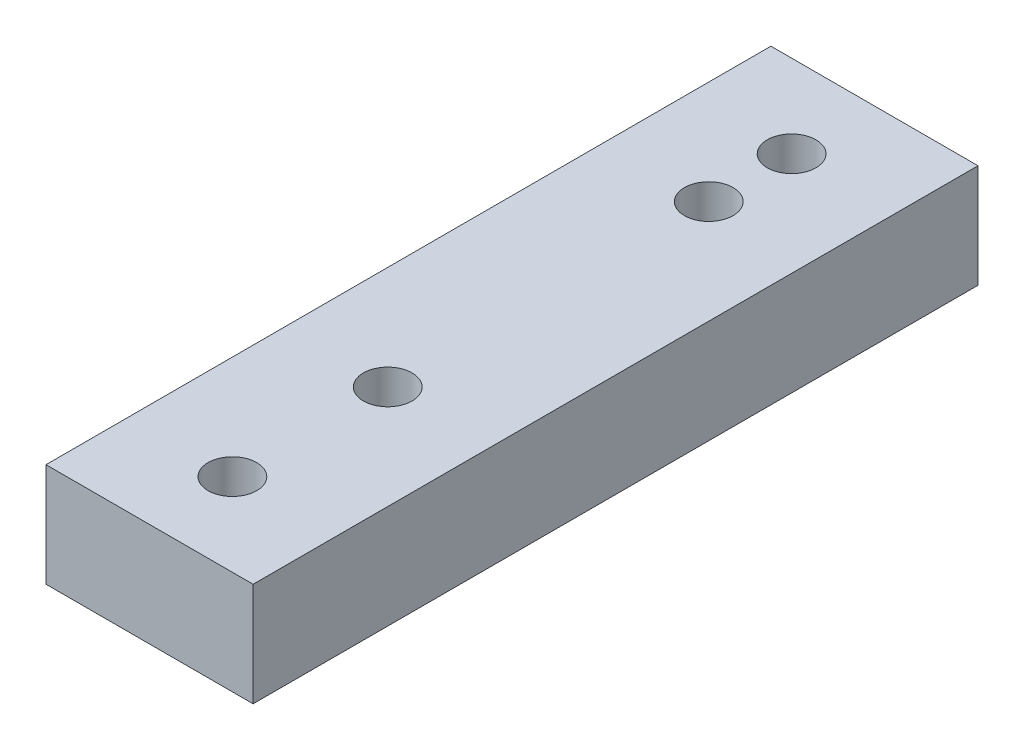
ISO-10303-21;
HEADER;
FILE_DESCRIPTION(('STEP AP214'),'2;1');
FILE_NAME('part.step','',(''),(''),'','','');
FILE_SCHEMA(('AUTOMOTIVE_DESIGN { 1 0 10303 214 1 1 1 1 }'));
ENDSEC;
DATA;
#1=APPLICATION_CONTEXT('core data for automotive mechanical design processes');
#2=APPLICATION_PROTOCOL_DEFINITION('international standard','automotive_design',2000,#1);
#3=PRODUCT_CONTEXT('',#1,'mechanical');
#4=PRODUCT('Part','Part','',(#3));
#5=PRODUCT_RELATED_PRODUCT_CATEGORY('part','',(#4));
#6=PRODUCT_DEFINITION_FORMATION('','',#4);
#7=PRODUCT_DEFINITION_CONTEXT('part definition',#1,'design');
#8=PRODUCT_DEFINITION('design','',#6,#7);
#9=PRODUCT_DEFINITION_SHAPE('','',#8);
#10=(LENGTH_UNIT() NAMED_UNIT(*) SI_UNIT(.MILLI.,.METRE.));
#11=(NAMED_UNIT(*) PLANE_ANGLE_UNIT() SI_UNIT($,.RADIAN.));
#12=(NAMED_UNIT(*) SI_UNIT($,.STERADIAN.) SOLID_ANGLE_UNIT());
#13=UNCERTAINTY_MEASURE_WITH_UNIT(LENGTH_MEASURE(1.E-05),#10,'distance_accuracy_value','');
#14=(GEOMETRIC_REPRESENTATION_CONTEXT(3) GLOBAL_UNCERTAINTY_ASSIGNED_CONTEXT((#13)) GLOBAL_UNIT_ASSIGNED_CONTEXT((#10,
#11,#12)) REPRESENTATION_CONTEXT('',''));
#15=CARTESIAN_POINT('',(0.,0.,0.));
#16=DIRECTION('',(0.,0.,1.));
#17=DIRECTION('',(1.,0.,0.));
#18=AXIS2_PLACEMENT_3D('',#15,#16,#17);
#19=CARTESIAN_POINT('',(0.,10.,0.));
#20=DIRECTION('',(0.,-1.,0.));
#21=DIRECTION('',(0.,0.,-1.));
#22=AXIS2_PLACEMENT_3D('',#19,#20,#21);
#23=PLANE('',#22);
#24=DIRECTION('',(0.,0.,1.));
#25=VECTOR('',#24,1.);
#26=CARTESIAN_POINT('',(0.,10.,0.));
#27=LINE('',#26,#25);
#28=CARTESIAN_POINT('',(0.,10.,-70.));
#29=VERTEX_POINT('',#28);
#30=CARTESIAN_POINT('',(0.,10.,0.));
#31=VERTEX_POINT('',#30);
#32=EDGE_CURVE('E88',#29,#31,#27,.T.);
#33=ORIENTED_EDGE('',*,*,#32,.T.);
#34=DIRECTION('',(1.,0.,0.));
#35=VECTOR('',#34,1.);
#36=CARTESIAN_POINT('',(0.,10.,0.));
#37=LINE('',#36,#35);
#38=CARTESIAN_POINT('',(20.,10.,0.));
#39=VERTEX_POINT('',#38);
#40=EDGE_CURVE('E83',#31,#39,#37,.T.);
#41=ORIENTED_EDGE('',*,*,#40,.T.);
#42=DIRECTION('',(0.,0.,-1.));
#43=VECTOR('',#42,1.);
#44=CARTESIAN_POINT('',(20.,10.,0.));
#45=LINE('',#44,#43);
#46=CARTESIAN_POINT('',(20.,10.,-70.));
#47=VERTEX_POINT('',#46);
#48=EDGE_CURVE('E86',#39,#47,#45,.T.);
#49=ORIENTED_EDGE('',*,*,#48,.T.);
#50=DIRECTION('',(-1.,0.,0.));
#51=VECTOR('',#50,1.);
#52=CARTESIAN_POINT('',(0.,10.,-70.));
#53=LINE('',#52,#51);
#54=EDGE_CURVE('E53',#47,#29,#53,.T.);
#55=ORIENTED_EDGE('',*,*,#54,.T.);
#56=EDGE_LOOP('',(#33,#41,#49,#55));
#57=FACE_BOUND('',#56,.T.);
#58=CARTESIAN_POINT('',(9.99999999999999,10.,-62.));
#59=DIRECTION('',(0.,1.,0.));
#60=DIRECTION('',(0.,0.,1.));
#61=AXIS2_PLACEMENT_3D('',#58,#59,#60);
#62=CIRCLE('',#61,2.35);
#63=CARTESIAN_POINT('',(9.99999999999999,10.,-59.65));
#64=VERTEX_POINT('',#63);
#65=EDGE_CURVE('E103',#64,#64,#62,.T.);
#66=ORIENTED_EDGE('',*,*,#65,.F.);
#67=EDGE_LOOP('',(#66));
#68=FACE_BOUND('',#67,.T.);
#69=CARTESIAN_POINT('',(9.99999999999999,10.,-54.));
#70=DIRECTION('',(0.,1.,0.));
#71=DIRECTION('',(0.,0.,1.));
#72=AXIS2_PLACEMENT_3D('',#69,#70,#71);
#73=CIRCLE('',#72,2.35);
#74=CARTESIAN_POINT('',(9.99999999999999,10.,-51.65));
#75=VERTEX_POINT('',#74);
#76=EDGE_CURVE('E118',#75,#75,#73,.T.);
#77=ORIENTED_EDGE('',*,*,#76,.F.);
#78=EDGE_LOOP('',(#77));
#79=FACE_BOUND('',#78,.T.);
#80=CARTESIAN_POINT('',(10.,10.,-23.));
#81=DIRECTION('',(0.,1.,0.));
#82=DIRECTION('',(0.,0.,1.));
#83=AXIS2_PLACEMENT_3D('',#80,#81,#82);
#84=CIRCLE('',#83,2.35);
#85=CARTESIAN_POINT('',(10.,10.,-20.65));
#86=VERTEX_POINT('',#85);
#87=EDGE_CURVE('E124',#86,#86,#84,.T.);
#88=ORIENTED_EDGE('',*,*,#87,.F.);
#89=EDGE_LOOP('',(#88));
#90=FACE_BOUND('',#89,.T.);
#91=CARTESIAN_POINT('',(10.,10.,-8.));
#92=DIRECTION('',(0.,1.,0.));
#93=DIRECTION('',(0.,0.,1.));
#94=AXIS2_PLACEMENT_3D('',#91,#92,#93);
#95=CIRCLE('',#94,2.35);
#96=CARTESIAN_POINT('',(10.,10.,-5.65));
#97=VERTEX_POINT('',#96);
#98=EDGE_CURVE('E130',#97,#97,#95,.T.);
#99=ORIENTED_EDGE('',*,*,#98,.F.);
#100=EDGE_LOOP('',(#99));
#101=FACE_BOUND('',#100,.T.);
#102=ADVANCED_FACE('F36',(#57,#68,#79,#90,#101),#23,.F.);
#103=CARTESIAN_POINT('',(0.,0.,0.));
#104=DIRECTION('',(0.,-1.,0.));
#105=DIRECTION('',(0.,0.,-1.));
#106=AXIS2_PLACEMENT_3D('',#103,#104,#105);
#107=PLANE('',#106);
#108=CARTESIAN_POINT('',(10.,0.,-23.));
#109=DIRECTION('',(0.,1.,0.));
#110=DIRECTION('',(0.,0.,1.));
#111=AXIS2_PLACEMENT_3D('',#108,#109,#110);
#112=CIRCLE('',#111,2.35);
#113=CARTESIAN_POINT('',(10.,0.,-20.65));
#114=VERTEX_POINT('',#113);
#115=EDGE_CURVE('E127',#114,#114,#112,.T.);
#116=ORIENTED_EDGE('',*,*,#115,.T.);
#117=EDGE_LOOP('',(#116));
#118=FACE_BOUND('',#117,.T.);
#119=CARTESIAN_POINT('',(9.99999999999999,0.,-62.));
#120=DIRECTION('',(0.,1.,0.));
#121=DIRECTION('',(0.,0.,1.));
#122=AXIS2_PLACEMENT_3D('',#119,#120,#121);
#123=CIRCLE('',#122,2.35);
#124=CARTESIAN_POINT('',(9.99999999999999,0.,-59.65));
#125=VERTEX_POINT('',#124);
#126=EDGE_CURVE('E115',#125,#125,#123,.T.);
#127=ORIENTED_EDGE('',*,*,#126,.T.);
#128=EDGE_LOOP('',(#127));
#129=FACE_BOUND('',#128,.T.);
#130=DIRECTION('',(0.,0.,1.));
#131=VECTOR('',#130,1.);
#132=CARTESIAN_POINT('',(0.,0.,0.));
#133=LINE('',#132,#131);
#134=CARTESIAN_POINT('',(0.,0.,-70.));
#135=VERTEX_POINT('',#134);
#136=CARTESIAN_POINT('',(0.,0.,0.));
#137=VERTEX_POINT('',#136);
#138=EDGE_CURVE('E100',#135,#137,#133,.T.);
#139=ORIENTED_EDGE('',*,*,#138,.F.);
#140=DIRECTION('',(-1.,0.,0.));
#141=VECTOR('',#140,1.);
#142=CARTESIAN_POINT('',(0.,0.,-70.));
#143=LINE('',#142,#141);
#144=CARTESIAN_POINT('',(20.,0.,-70.));
#145=VERTEX_POINT('',#144);
#146=EDGE_CURVE('E76',#145,#135,#143,.T.);
#147=ORIENTED_EDGE('',*,*,#146,.F.);
#148=DIRECTION('',(0.,0.,-1.));
#149=VECTOR('',#148,1.);
#150=CARTESIAN_POINT('',(20.,0.,0.));
#151=LINE('',#150,#149);
#152=CARTESIAN_POINT('',(20.,0.,0.));
#153=VERTEX_POINT('',#152);
#154=EDGE_CURVE('E70',#153,#145,#151,.T.);
#155=ORIENTED_EDGE('',*,*,#154,.F.);
#156=DIRECTION('',(1.,0.,0.));
#157=VECTOR('',#156,1.);
#158=CARTESIAN_POINT('',(0.,0.,0.));
#159=LINE('',#158,#157);
#160=EDGE_CURVE('E92',#137,#153,#159,.T.);
#161=ORIENTED_EDGE('',*,*,#160,.F.);
#162=EDGE_LOOP('',(#139,#147,#155,#161));
#163=FACE_BOUND('',#162,.T.);
#164=CARTESIAN_POINT('',(9.99999999999999,0.,-54.));
#165=DIRECTION('',(0.,1.,0.));
#166=DIRECTION('',(0.,0.,1.));
#167=AXIS2_PLACEMENT_3D('',#164,#165,#166);
#168=CIRCLE('',#167,2.35);
#169=CARTESIAN_POINT('',(9.99999999999999,0.,-51.65));
#170=VERTEX_POINT('',#169);
#171=EDGE_CURVE('E121',#170,#170,#168,.T.);
#172=ORIENTED_EDGE('',*,*,#171,.T.);
#173=EDGE_LOOP('',(#172));
#174=FACE_BOUND('',#173,.T.);
#175=CARTESIAN_POINT('',(10.,0.,-8.));
#176=DIRECTION('',(0.,1.,0.));
#177=DIRECTION('',(0.,0.,1.));
#178=AXIS2_PLACEMENT_3D('',#175,#176,#177);
#179=CIRCLE('',#178,2.35);
#180=CARTESIAN_POINT('',(10.,0.,-5.65));
#181=VERTEX_POINT('',#180);
#182=EDGE_CURVE('E133',#181,#181,#179,.T.);
#183=ORIENTED_EDGE('',*,*,#182,.T.);
#184=EDGE_LOOP('',(#183));
#185=FACE_BOUND('',#184,.T.);
#186=ADVANCED_FACE('F111',(#118,#129,#163,#174,#185),#107,.T.);
#187=CARTESIAN_POINT('',(0.,10.,0.));
#188=DIRECTION('',(1.,0.,0.));
#189=DIRECTION('',(0.,0.,-1.));
#190=AXIS2_PLACEMENT_3D('',#187,#188,#189);
#191=PLANE('',#190);
#192=ORIENTED_EDGE('',*,*,#138,.T.);
#193=DIRECTION('',(0.,-1.,0.));
#194=VECTOR('',#193,1.);
#195=CARTESIAN_POINT('',(0.,10.,0.));
#196=LINE('',#195,#194);
#197=EDGE_CURVE('E11',#31,#137,#196,.T.);
#198=ORIENTED_EDGE('',*,*,#197,.F.);
#199=ORIENTED_EDGE('',*,*,#32,.F.);
#200=DIRECTION('',(0.,-1.,0.));
#201=VECTOR('',#200,1.);
#202=CARTESIAN_POINT('',(0.,10.,-70.));
#203=LINE('',#202,#201);
#204=EDGE_CURVE('E96',#29,#135,#203,.T.);
#205=ORIENTED_EDGE('',*,*,#204,.T.);
#206=EDGE_LOOP('',(#192,#198,#199,#205));
#207=FACE_BOUND('',#206,.T.);
#208=ADVANCED_FACE('F38',(#207),#191,.F.);
#209=CARTESIAN_POINT('',(0.,10.,0.));
#210=DIRECTION('',(0.,0.,-1.));
#211=DIRECTION('',(-1.,0.,0.));
#212=AXIS2_PLACEMENT_3D('',#209,#210,#211);
#213=PLANE('',#212);
#214=ORIENTED_EDGE('',*,*,#160,.T.);
#215=DIRECTION('',(0.,-1.,0.));
#216=VECTOR('',#215,1.);
#217=CARTESIAN_POINT('',(20.,10.,0.));
#218=LINE('',#217,#216);
#219=EDGE_CURVE('E45',#39,#153,#218,.T.);
#220=ORIENTED_EDGE('',*,*,#219,.F.);
#221=ORIENTED_EDGE('',*,*,#40,.F.);
#222=ORIENTED_EDGE('',*,*,#197,.T.);
#223=EDGE_LOOP('',(#214,#220,#221,#222));
#224=FACE_BOUND('',#223,.T.);
#225=ADVANCED_FACE('F91',(#224),#213,.F.);
#226=CARTESIAN_POINT('',(20.,10.,0.));
#227=DIRECTION('',(-1.,0.,0.));
#228=DIRECTION('',(0.,0.,1.));
#229=AXIS2_PLACEMENT_3D('',#226,#227,#228);
#230=PLANE('',#229);
#231=ORIENTED_EDGE('',*,*,#154,.T.);
#232=DIRECTION('',(0.,-1.,0.));
#233=VECTOR('',#232,1.);
#234=CARTESIAN_POINT('',(20.,10.,-70.));
#235=LINE('',#234,#233);
#236=EDGE_CURVE('E93',#47,#145,#235,.T.);
#237=ORIENTED_EDGE('',*,*,#236,.F.);
#238=ORIENTED_EDGE('',*,*,#48,.F.);
#239=ORIENTED_EDGE('',*,*,#219,.T.);
#240=EDGE_LOOP('',(#231,#237,#238,#239));
#241=FACE_BOUND('',#240,.T.);
#242=ADVANCED_FACE('F94',(#241),#230,.F.);
#243=CARTESIAN_POINT('',(0.,10.,-70.));
#244=DIRECTION('',(0.,0.,1.));
#245=DIRECTION('',(1.,0.,0.));
#246=AXIS2_PLACEMENT_3D('',#243,#244,#245);
#247=PLANE('',#246);
#248=ORIENTED_EDGE('',*,*,#146,.T.);
#249=ORIENTED_EDGE('',*,*,#204,.F.);
#250=ORIENTED_EDGE('',*,*,#54,.F.);
#251=ORIENTED_EDGE('',*,*,#236,.T.);
#252=EDGE_LOOP('',(#248,#249,#250,#251));
#253=FACE_BOUND('',#252,.T.);
#254=ADVANCED_FACE('F108',(#253),#247,.F.);
#255=CARTESIAN_POINT('',(9.99999999999999,10.,-62.));
#256=DIRECTION('',(0.,-1.,0.));
#257=DIRECTION('',(0.,0.,-1.));
#258=AXIS2_PLACEMENT_3D('',#255,#256,#257);
#259=CYLINDRICAL_SURFACE('',#258,2.35);
#260=ORIENTED_EDGE('',*,*,#65,.T.);
#261=EDGE_LOOP('',(#260));
#262=FACE_BOUND('',#261,.T.);
#263=ORIENTED_EDGE('',*,*,#126,.F.);
#264=EDGE_LOOP('',(#263));
#265=FACE_BOUND('',#264,.T.);
#266=ADVANCED_FACE('F150',(#262,#265),#259,.F.);
#267=CARTESIAN_POINT('',(9.99999999999999,10.,-54.));
#268=DIRECTION('',(0.,-1.,0.));
#269=DIRECTION('',(0.,0.,-1.));
#270=AXIS2_PLACEMENT_3D('',#267,#268,#269);
#271=CYLINDRICAL_SURFACE('',#270,2.35);
#272=ORIENTED_EDGE('',*,*,#76,.T.);
#273=EDGE_LOOP('',(#272));
#274=FACE_BOUND('',#273,.T.);
#275=ORIENTED_EDGE('',*,*,#171,.F.);
#276=EDGE_LOOP('',(#275));
#277=FACE_BOUND('',#276,.T.);
#278=ADVANCED_FACE('F204',(#274,#277),#271,.F.);
#279=CARTESIAN_POINT('',(10.,10.,-23.));
#280=DIRECTION('',(0.,-1.,0.));
#281=DIRECTION('',(0.,0.,-1.));
#282=AXIS2_PLACEMENT_3D('',#279,#280,#281);
#283=CYLINDRICAL_SURFACE('',#282,2.35);
#284=ORIENTED_EDGE('',*,*,#87,.T.);
#285=EDGE_LOOP('',(#284));
#286=FACE_BOUND('',#285,.T.);
#287=ORIENTED_EDGE('',*,*,#115,.F.);
#288=EDGE_LOOP('',(#287));
#289=FACE_BOUND('',#288,.T.);
#290=ADVANCED_FACE('F213',(#286,#289),#283,.F.);
#291=CARTESIAN_POINT('',(10.,10.,-8.));
#292=DIRECTION('',(0.,-1.,0.));
#293=DIRECTION('',(0.,0.,-1.));
#294=AXIS2_PLACEMENT_3D('',#291,#292,#293);
#295=CYLINDRICAL_SURFACE('',#294,2.35);
#296=ORIENTED_EDGE('',*,*,#98,.T.);
#297=EDGE_LOOP('',(#296));
#298=FACE_BOUND('',#297,.T.);
#299=ORIENTED_EDGE('',*,*,#182,.F.);
#300=EDGE_LOOP('',(#299));
#301=FACE_BOUND('',#300,.T.);
#302=ADVANCED_FACE('F139',(#298,#301),#295,.F.);
#303=CLOSED_SHELL('',(#102,#186,#208,#225,#242,#254,#266,#278,#290,#302));
#304=MANIFOLD_SOLID_BREP('B2',#303);
#305=ADVANCED_BREP_SHAPE_REPRESENTATION('',(#18,#304),#14);
#306=SHAPE_DEFINITION_REPRESENTATION(#9,#305);
ENDSEC;
END-ISO-10303-21;
